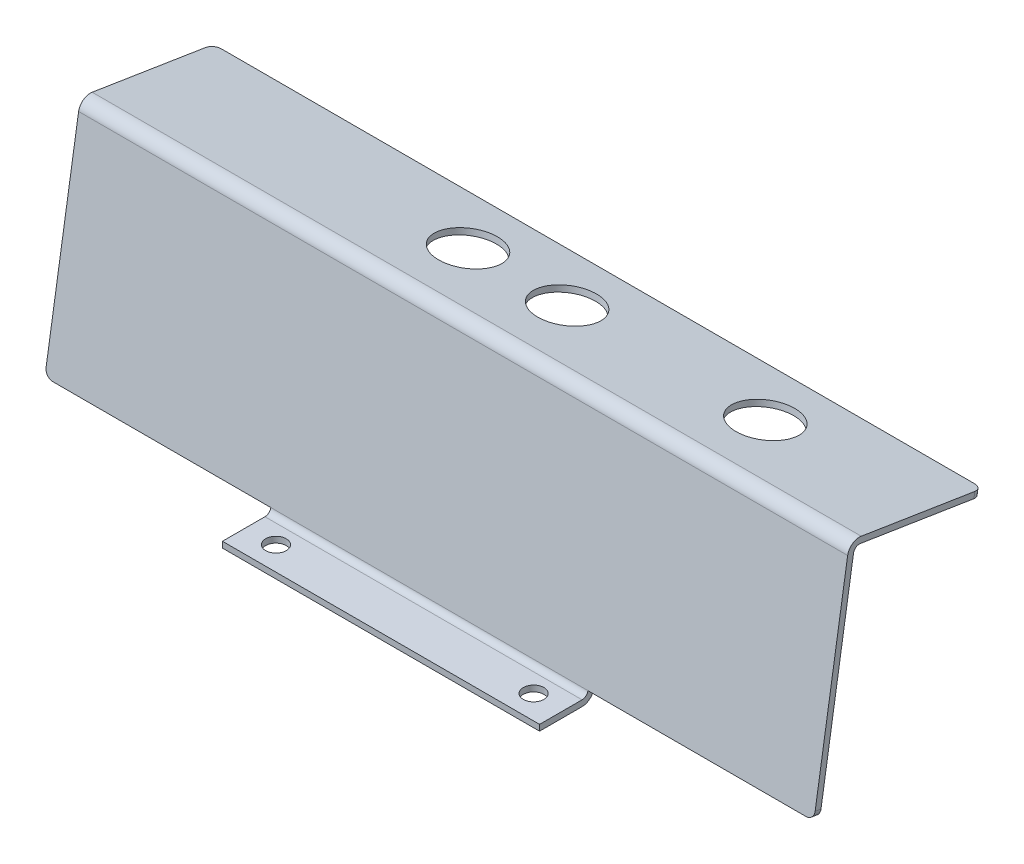
ISO-10303-21;
HEADER;
FILE_DESCRIPTION(('STEP AP214'),'2;1');
FILE_NAME('part.step','',(''),(''),'','','');
FILE_SCHEMA(('AUTOMOTIVE_DESIGN { 1 0 10303 214 1 1 1 1 }'));
ENDSEC;
DATA;
#1=APPLICATION_CONTEXT('core data for automotive mechanical design processes');
#2=APPLICATION_PROTOCOL_DEFINITION('international standard','automotive_design',2000,#1);
#3=PRODUCT_CONTEXT('',#1,'mechanical');
#4=PRODUCT('Part','Part','',(#3));
#5=PRODUCT_RELATED_PRODUCT_CATEGORY('part','',(#4));
#6=PRODUCT_DEFINITION_FORMATION('','',#4);
#7=PRODUCT_DEFINITION_CONTEXT('part definition',#1,'design');
#8=PRODUCT_DEFINITION('design','',#6,#7);
#9=PRODUCT_DEFINITION_SHAPE('','',#8);
#10=(LENGTH_UNIT() NAMED_UNIT(*) SI_UNIT(.MILLI.,.METRE.));
#11=(NAMED_UNIT(*) PLANE_ANGLE_UNIT() SI_UNIT($,.RADIAN.));
#12=(NAMED_UNIT(*) SI_UNIT($,.STERADIAN.) SOLID_ANGLE_UNIT());
#13=UNCERTAINTY_MEASURE_WITH_UNIT(LENGTH_MEASURE(1.E-05),#10,'distance_accuracy_value','');
#14=(GEOMETRIC_REPRESENTATION_CONTEXT(3) GLOBAL_UNCERTAINTY_ASSIGNED_CONTEXT((#13)) GLOBAL_UNIT_ASSIGNED_CONTEXT((#10,
#11,#12)) REPRESENTATION_CONTEXT('',''));
#15=CARTESIAN_POINT('',(0.,0.,0.));
#16=DIRECTION('',(0.,0.,1.));
#17=DIRECTION('',(1.,0.,0.));
#18=AXIS2_PLACEMENT_3D('',#15,#16,#17);
#19=CARTESIAN_POINT('',(0.,54.1771803219008,-54.767059999951));
#20=DIRECTION('',(0.,0.987688340595138,-0.15643446504023));
#21=DIRECTION('',(0.,0.15643446504023,0.987688340595138));
#22=AXIS2_PLACEMENT_3D('',#19,#20,#21);
#23=PLANE('',#22);
#24=CARTESIAN_POINT('',(79.,56.5236972975042,-39.9517348910239));
#25=DIRECTION('',(0.,0.987688340595138,-0.15643446504023));
#26=DIRECTION('',(0.,0.15643446504023,0.987688340595138));
#27=AXIS2_PLACEMENT_3D('',#24,#25,#26);
#28=CIRCLE('',#27,7.5);
#29=CARTESIAN_POINT('',(79.,57.696955785306,-32.5440723365604));
#30=VERTEX_POINT('',#29);
#31=EDGE_CURVE('E234',#30,#30,#28,.F.);
#32=ORIENTED_EDGE('',*,*,#31,.T.);
#33=EDGE_LOOP('',(#32));
#34=FACE_BOUND('',#33,.T.);
#35=CARTESIAN_POINT('',(154.,56.5236972975042,-39.9517348910239));
#36=DIRECTION('',(0.,0.987688340595138,-0.15643446504023));
#37=DIRECTION('',(0.,0.15643446504023,0.987688340595138));
#38=AXIS2_PLACEMENT_3D('',#35,#36,#37);
#39=CIRCLE('',#38,7.5);
#40=CARTESIAN_POINT('',(154.,57.696955785306,-32.5440723365604));
#41=VERTEX_POINT('',#40);
#42=EDGE_CURVE('E238',#41,#41,#39,.F.);
#43=ORIENTED_EDGE('',*,*,#42,.T.);
#44=EDGE_LOOP('',(#43));
#45=FACE_BOUND('',#44,.T.);
#46=CARTESIAN_POINT('',(104.,56.5236972975042,-39.9517348910239));
#47=DIRECTION('',(0.,0.987688340595138,-0.15643446504023));
#48=DIRECTION('',(0.,0.15643446504023,0.987688340595138));
#49=AXIS2_PLACEMENT_3D('',#46,#47,#48);
#50=CIRCLE('',#49,7.5);
#51=CARTESIAN_POINT('',(104.,57.696955785306,-32.5440723365604));
#52=VERTEX_POINT('',#51);
#53=EDGE_CURVE('E139',#52,#52,#50,.F.);
#54=ORIENTED_EDGE('',*,*,#53,.T.);
#55=EDGE_LOOP('',(#54));
#56=FACE_BOUND('',#55,.T.);
#57=CARTESIAN_POINT('',(192.,54.4900492519813,-52.7916833187607));
#58=DIRECTION('',(0.,0.987688340595139,-0.156434465040224));
#59=DIRECTION('',(0.,0.156434465040224,0.987688340595139));
#60=AXIS2_PLACEMENT_3D('',#57,#58,#59);
#61=CIRCLE('',#60,2.);
#62=CARTESIAN_POINT('',(192.,54.1771803219008,-54.767059999951));
#63=VERTEX_POINT('',#62);
#64=CARTESIAN_POINT('',(194.,54.4900492519813,-52.7916833187607));
#65=VERTEX_POINT('',#64);
#66=EDGE_CURVE('E153',#63,#65,#61,.F.);
#67=ORIENTED_EDGE('',*,*,#66,.F.);
#68=DIRECTION('',(1.,0.,0.));
#69=VECTOR('',#68,1.);
#70=CARTESIAN_POINT('',(0.,54.1771803219008,-54.767059999951));
#71=LINE('',#70,#69);
#72=CARTESIAN_POINT('',(2.,54.1771803219008,-54.767059999951));
#73=VERTEX_POINT('',#72);
#74=EDGE_CURVE('E128',#73,#63,#71,.T.);
#75=ORIENTED_EDGE('',*,*,#74,.F.);
#76=CARTESIAN_POINT('',(2.,54.4900492519813,-52.7916833187607));
#77=DIRECTION('',(0.,0.987688340595139,-0.156434465040224));
#78=DIRECTION('',(0.,0.156434465040224,0.987688340595139));
#79=AXIS2_PLACEMENT_3D('',#76,#77,#78);
#80=CIRCLE('',#79,2.);
#81=CARTESIAN_POINT('',(0.,54.4900492519813,-52.7916833187607));
#82=VERTEX_POINT('',#81);
#83=EDGE_CURVE('E20',#82,#73,#80,.F.);
#84=ORIENTED_EDGE('',*,*,#83,.F.);
#85=DIRECTION('',(0.,0.15643446504023,0.987688340595138));
#86=VECTOR('',#85,1.);
#87=CARTESIAN_POINT('',(0.,54.4900492519813,-52.7916833187607));
#88=LINE('',#87,#86);
#89=CARTESIAN_POINT('',(0.,59.0266487381479,-24.1487214415017));
#90=VERTEX_POINT('',#89);
#91=EDGE_CURVE('E125',#82,#90,#88,.T.);
#92=ORIENTED_EDGE('',*,*,#91,.T.);
#93=DIRECTION('',(1.,0.,0.));
#94=VECTOR('',#93,1.);
#95=CARTESIAN_POINT('',(97.,59.0266487381479,-24.1487214415017));
#96=LINE('',#95,#94);
#97=CARTESIAN_POINT('',(194.,59.0266487381479,-24.1487214415017));
#98=VERTEX_POINT('',#97);
#99=EDGE_CURVE('E225',#98,#90,#96,.F.);
#100=ORIENTED_EDGE('',*,*,#99,.F.);
#101=DIRECTION('',(0.,0.15643446504023,0.987688340595138));
#102=VECTOR('',#101,1.);
#103=CARTESIAN_POINT('',(194.,54.4900492519813,-52.7916833187607));
#104=LINE('',#103,#102);
#105=EDGE_CURVE('E145',#65,#98,#104,.T.);
#106=ORIENTED_EDGE('',*,*,#105,.F.);
#107=EDGE_LOOP('',(#67,#75,#84,#92,#100,#106));
#108=FACE_BOUND('',#107,.T.);
#109=ADVANCED_FACE('F17',(#34,#45,#56,#108),#23,.T.);
#110=CARTESIAN_POINT('',(2.,41.6564780579733,-50.7590453278328));
#111=DIRECTION('',(0.,0.987688340595139,-0.156434465040224));
#112=DIRECTION('',(0.,0.156434465040224,0.987688340595139));
#113=AXIS2_PLACEMENT_3D('',#110,#111,#112);
#114=CYLINDRICAL_SURFACE('',#113,2.);
#115=CARTESIAN_POINT('',(2.,53.0085167410885,-52.5570316212004));
#116=DIRECTION('',(0.,0.987688340595139,-0.156434465040224));
#117=DIRECTION('',(0.,0.156434465040224,0.987688340595139));
#118=AXIS2_PLACEMENT_3D('',#115,#116,#117);
#119=CIRCLE('',#118,2.);
#120=CARTESIAN_POINT('',(0.,53.0085167410885,-52.5570316212004));
#121=VERTEX_POINT('',#120);
#122=CARTESIAN_POINT('',(2.,52.6956478110081,-54.5324083023907));
#123=VERTEX_POINT('',#122);
#124=EDGE_CURVE('E136',#121,#123,#119,.F.);
#125=ORIENTED_EDGE('',*,*,#124,.F.);
#126=DIRECTION('',(0.,0.987688340595139,-0.156434465040224));
#127=VECTOR('',#126,1.);
#128=CARTESIAN_POINT('',(0.,53.0085167410885,-52.5570316212004));
#129=LINE('',#128,#127);
#130=EDGE_CURVE('E133',#121,#82,#129,.T.);
#131=ORIENTED_EDGE('',*,*,#130,.T.);
#132=ORIENTED_EDGE('',*,*,#83,.T.);
#133=DIRECTION('',(0.,0.987688340595139,-0.156434465040224));
#134=VECTOR('',#133,1.);
#135=CARTESIAN_POINT('',(2.,52.6956478110081,-54.5324083023906));
#136=LINE('',#135,#134);
#137=EDGE_CURVE('E131',#123,#73,#136,.T.);
#138=ORIENTED_EDGE('',*,*,#137,.F.);
#139=EDGE_LOOP('',(#125,#131,#132,#138));
#140=FACE_BOUND('',#139,.T.);
#141=ADVANCED_FACE('F134',(#140),#114,.T.);
#142=CARTESIAN_POINT('',(0.,52.6956478110081,-54.5324083023906));
#143=DIRECTION('',(0.,-0.156434465040224,-0.987688340595139));
#144=DIRECTION('',(0.,0.987688340595139,-0.156434465040224));
#145=AXIS2_PLACEMENT_3D('',#142,#143,#144);
#146=PLANE('',#145);
#147=DIRECTION('',(0.,0.987688340595139,-0.156434465040224));
#148=VECTOR('',#147,1.);
#149=CARTESIAN_POINT('',(192.,41.3436091278929,-52.734422009023));
#150=LINE('',#149,#148);
#151=CARTESIAN_POINT('',(192.,52.6956478110081,-54.5324083023906));
#152=VERTEX_POINT('',#151);
#153=EDGE_CURVE('E242',#152,#63,#150,.T.);
#154=ORIENTED_EDGE('',*,*,#153,.F.);
#155=DIRECTION('',(1.,0.,0.));
#156=VECTOR('',#155,1.);
#157=CARTESIAN_POINT('',(0.,52.6956478110081,-54.5324083023907));
#158=LINE('',#157,#156);
#159=EDGE_CURVE('E220',#123,#152,#158,.T.);
#160=ORIENTED_EDGE('',*,*,#159,.F.);
#161=ORIENTED_EDGE('',*,*,#137,.T.);
#162=ORIENTED_EDGE('',*,*,#74,.T.);
#163=EDGE_LOOP('',(#154,#160,#161,#162));
#164=FACE_BOUND('',#163,.T.);
#165=ADVANCED_FACE('F252',(#164),#146,.T.);
#166=CARTESIAN_POINT('',(192.,41.6564780579733,-50.7590453278328));
#167=DIRECTION('',(0.,0.987688340595139,-0.156434465040224));
#168=DIRECTION('',(0.,0.156434465040224,0.987688340595139));
#169=AXIS2_PLACEMENT_3D('',#166,#167,#168);
#170=CYLINDRICAL_SURFACE('',#169,2.);
#171=CARTESIAN_POINT('',(192.,53.0085167410885,-52.5570316212004));
#172=DIRECTION('',(0.,0.987688340595139,-0.156434465040224));
#173=DIRECTION('',(0.,0.156434465040224,0.987688340595139));
#174=AXIS2_PLACEMENT_3D('',#171,#172,#173);
#175=CIRCLE('',#174,2.);
#176=CARTESIAN_POINT('',(194.,53.0085167410885,-52.5570316212004));
#177=VERTEX_POINT('',#176);
#178=EDGE_CURVE('E216',#152,#177,#175,.F.);
#179=ORIENTED_EDGE('',*,*,#178,.F.);
#180=ORIENTED_EDGE('',*,*,#153,.T.);
#181=ORIENTED_EDGE('',*,*,#66,.T.);
#182=DIRECTION('',(0.,0.987688340595139,-0.156434465040224));
#183=VECTOR('',#182,1.);
#184=CARTESIAN_POINT('',(194.,53.0085167410885,-52.5570316212004));
#185=LINE('',#184,#183);
#186=EDGE_CURVE('E148',#177,#65,#185,.T.);
#187=ORIENTED_EDGE('',*,*,#186,.F.);
#188=EDGE_LOOP('',(#179,#180,#181,#187));
#189=FACE_BOUND('',#188,.T.);
#190=ADVANCED_FACE('F295',(#189),#170,.T.);
#191=CARTESIAN_POINT('',(104.,55.7829310420579,-39.8344090422437));
#192=DIRECTION('',(0.,0.987688340595138,-0.15643446504023));
#193=DIRECTION('',(0.,0.15643446504023,0.987688340595138));
#194=AXIS2_PLACEMENT_3D('',#191,#192,#193);
#195=CYLINDRICAL_SURFACE('',#194,7.5);
#196=CARTESIAN_POINT('',(104.,55.0421647866115,-39.7170831934636));
#197=DIRECTION('',(0.,0.987688340595138,-0.15643446504023));
#198=DIRECTION('',(0.,0.15643446504023,0.987688340595138));
#199=AXIS2_PLACEMENT_3D('',#196,#197,#198);
#200=CIRCLE('',#199,7.5);
#201=CARTESIAN_POINT('',(104.,56.2154232744133,-32.309420639));
#202=VERTEX_POINT('',#201);
#203=EDGE_CURVE('E212',#202,#202,#200,.T.);
#204=ORIENTED_EDGE('',*,*,#203,.F.);
#205=EDGE_LOOP('',(#204));
#206=FACE_BOUND('',#205,.T.);
#207=ORIENTED_EDGE('',*,*,#53,.F.);
#208=EDGE_LOOP('',(#207));
#209=FACE_BOUND('',#208,.T.);
#210=ADVANCED_FACE('F591',(#206,#209),#195,.F.);
#211=CARTESIAN_POINT('',(154.,55.7829310420579,-39.8344090422437));
#212=DIRECTION('',(0.,0.987688340595138,-0.15643446504023));
#213=DIRECTION('',(0.,0.15643446504023,0.987688340595138));
#214=AXIS2_PLACEMENT_3D('',#211,#212,#213);
#215=CYLINDRICAL_SURFACE('',#214,7.5);
#216=CARTESIAN_POINT('',(154.,55.0421647866115,-39.7170831934636));
#217=DIRECTION('',(0.,0.987688340595138,-0.15643446504023));
#218=DIRECTION('',(0.,0.15643446504023,0.987688340595138));
#219=AXIS2_PLACEMENT_3D('',#216,#217,#218);
#220=CIRCLE('',#219,7.5);
#221=CARTESIAN_POINT('',(154.,56.2154232744133,-32.309420639));
#222=VERTEX_POINT('',#221);
#223=EDGE_CURVE('E209',#222,#222,#220,.T.);
#224=ORIENTED_EDGE('',*,*,#223,.F.);
#225=EDGE_LOOP('',(#224));
#226=FACE_BOUND('',#225,.T.);
#227=ORIENTED_EDGE('',*,*,#42,.F.);
#228=EDGE_LOOP('',(#227));
#229=FACE_BOUND('',#228,.T.);
#230=ADVANCED_FACE('F582',(#226,#229),#215,.F.);
#231=CARTESIAN_POINT('',(79.,55.7829310420579,-39.8344090422437));
#232=DIRECTION('',(0.,0.987688340595138,-0.15643446504023));
#233=DIRECTION('',(0.,0.15643446504023,0.987688340595138));
#234=AXIS2_PLACEMENT_3D('',#231,#232,#233);
#235=CYLINDRICAL_SURFACE('',#234,7.5);
#236=CARTESIAN_POINT('',(79.,55.0421647866115,-39.7170831934636));
#237=DIRECTION('',(0.,0.987688340595138,-0.15643446504023));
#238=DIRECTION('',(0.,0.15643446504023,0.987688340595138));
#239=AXIS2_PLACEMENT_3D('',#236,#237,#238);
#240=CIRCLE('',#239,7.5);
#241=CARTESIAN_POINT('',(79.,56.2154232744133,-32.309420639));
#242=VERTEX_POINT('',#241);
#243=EDGE_CURVE('E206',#242,#242,#240,.T.);
#244=ORIENTED_EDGE('',*,*,#243,.F.);
#245=EDGE_LOOP('',(#244));
#246=FACE_BOUND('',#245,.T.);
#247=ORIENTED_EDGE('',*,*,#31,.F.);
#248=EDGE_LOOP('',(#247));
#249=FACE_BOUND('',#248,.T.);
#250=ADVANCED_FACE('F574',(#246,#249),#235,.F.);
#251=CARTESIAN_POINT('',(0.,1.5,0.));
#252=DIRECTION('',(0.,0.,1.));
#253=DIRECTION('',(1.,0.,0.));
#254=AXIS2_PLACEMENT_3D('',#251,#252,#253);
#255=PLANE('',#254);
#256=DIRECTION('',(0.,1.,0.));
#257=VECTOR('',#256,1.);
#258=CARTESIAN_POINT('',(57.,1.5,0.));
#259=LINE('',#258,#257);
#260=CARTESIAN_POINT('',(57.,1.5,0.));
#261=VERTEX_POINT('',#260);
#262=CARTESIAN_POINT('',(57.,0.,0.));
#263=VERTEX_POINT('',#262);
#264=EDGE_CURVE('E237',#261,#263,#259,.F.);
#265=ORIENTED_EDGE('',*,*,#264,.T.);
#266=DIRECTION('',(1.,0.,0.));
#267=VECTOR('',#266,1.);
#268=CARTESIAN_POINT('',(0.,0.,0.));
#269=LINE('',#268,#267);
#270=CARTESIAN_POINT('',(137.,0.,0.));
#271=VERTEX_POINT('',#270);
#272=EDGE_CURVE('E200',#271,#263,#269,.F.);
#273=ORIENTED_EDGE('',*,*,#272,.F.);
#274=DIRECTION('',(0.,1.,0.));
#275=VECTOR('',#274,1.);
#276=CARTESIAN_POINT('',(137.,-1.45955048827795,0.));
#277=LINE('',#276,#275);
#278=CARTESIAN_POINT('',(137.,1.5,0.));
#279=VERTEX_POINT('',#278);
#280=EDGE_CURVE('E281',#279,#271,#277,.F.);
#281=ORIENTED_EDGE('',*,*,#280,.F.);
#282=DIRECTION('',(1.,0.,0.));
#283=VECTOR('',#282,1.);
#284=CARTESIAN_POINT('',(0.,1.5,0.));
#285=LINE('',#284,#283);
#286=EDGE_CURVE('E233',#261,#279,#285,.T.);
#287=ORIENTED_EDGE('',*,*,#286,.F.);
#288=EDGE_LOOP('',(#265,#273,#281,#287));
#289=FACE_BOUND('',#288,.T.);
#290=ADVANCED_FACE('F389',(#289),#255,.T.);
#291=CARTESIAN_POINT('',(129.5,-208.678969407699,-6.00000000000008));
#292=DIRECTION('',(0.,1.,0.));
#293=DIRECTION('',(0.,0.,1.));
#294=AXIS2_PLACEMENT_3D('',#291,#292,#293);
#295=CYLINDRICAL_SURFACE('',#294,2.6);
#296=CARTESIAN_POINT('',(129.5,1.5,-6.00000000000003));
#297=DIRECTION('',(0.,1.,0.));
#298=DIRECTION('',(0.,0.,1.));
#299=AXIS2_PLACEMENT_3D('',#296,#297,#298);
#300=CIRCLE('',#299,2.6);
#301=CARTESIAN_POINT('',(129.5,1.5,-3.40000000000003));
#302=VERTEX_POINT('',#301);
#303=EDGE_CURVE('E230',#302,#302,#300,.F.);
#304=ORIENTED_EDGE('',*,*,#303,.F.);
#305=EDGE_LOOP('',(#304));
#306=FACE_BOUND('',#305,.T.);
#307=CARTESIAN_POINT('',(129.5,0.,-6.00000000000003));
#308=DIRECTION('',(0.,1.,0.));
#309=DIRECTION('',(0.,0.,1.));
#310=AXIS2_PLACEMENT_3D('',#307,#308,#309);
#311=CIRCLE('',#310,2.6);
#312=CARTESIAN_POINT('',(129.5,0.,-3.40000000000003));
#313=VERTEX_POINT('',#312);
#314=EDGE_CURVE('E197',#313,#313,#311,.T.);
#315=ORIENTED_EDGE('',*,*,#314,.F.);
#316=EDGE_LOOP('',(#315));
#317=FACE_BOUND('',#316,.T.);
#318=ADVANCED_FACE('F412',(#306,#317),#295,.F.);
#319=CARTESIAN_POINT('',(64.5,-208.678969407699,-6.00000000000004));
#320=DIRECTION('',(0.,1.,0.));
#321=DIRECTION('',(0.,0.,1.));
#322=AXIS2_PLACEMENT_3D('',#319,#320,#321);
#323=CYLINDRICAL_SURFACE('',#322,2.6);
#324=CARTESIAN_POINT('',(64.5,1.5,-5.99999999999999));
#325=DIRECTION('',(0.,1.,0.));
#326=DIRECTION('',(0.,0.,1.));
#327=AXIS2_PLACEMENT_3D('',#324,#325,#326);
#328=CIRCLE('',#327,2.6);
#329=CARTESIAN_POINT('',(64.5,1.5,-3.39999999999999));
#330=VERTEX_POINT('',#329);
#331=EDGE_CURVE('E226',#330,#330,#328,.F.);
#332=ORIENTED_EDGE('',*,*,#331,.F.);
#333=EDGE_LOOP('',(#332));
#334=FACE_BOUND('',#333,.T.);
#335=CARTESIAN_POINT('',(64.5,0.,-5.99999999999999));
#336=DIRECTION('',(0.,1.,0.));
#337=DIRECTION('',(0.,0.,1.));
#338=AXIS2_PLACEMENT_3D('',#335,#336,#337);
#339=CIRCLE('',#338,2.6);
#340=CARTESIAN_POINT('',(64.5,0.,-3.39999999999999));
#341=VERTEX_POINT('',#340);
#342=EDGE_CURVE('E193',#341,#341,#339,.T.);
#343=ORIENTED_EDGE('',*,*,#342,.F.);
#344=EDGE_LOOP('',(#343));
#345=FACE_BOUND('',#344,.T.);
#346=ADVANCED_FACE('F403',(#334,#345),#323,.F.);
#347=CARTESIAN_POINT('',(0.,1.5,-12.));
#348=DIRECTION('',(0.,1.,0.));
#349=DIRECTION('',(0.,0.,1.));
#350=AXIS2_PLACEMENT_3D('',#347,#348,#349);
#351=PLANE('',#350);
#352=ORIENTED_EDGE('',*,*,#331,.T.);
#353=EDGE_LOOP('',(#352));
#354=FACE_BOUND('',#353,.T.);
#355=ORIENTED_EDGE('',*,*,#303,.T.);
#356=EDGE_LOOP('',(#355));
#357=FACE_BOUND('',#356,.T.);
#358=DIRECTION('',(0.,0.,-1.));
#359=VECTOR('',#358,1.);
#360=CARTESIAN_POINT('',(57.,1.5,-5.67030667899987));
#361=LINE('',#360,#359);
#362=CARTESIAN_POINT('',(57.,1.5,-10.7188789718048));
#363=VERTEX_POINT('',#362);
#364=EDGE_CURVE('E196',#363,#261,#361,.F.);
#365=ORIENTED_EDGE('',*,*,#364,.T.);
#366=ORIENTED_EDGE('',*,*,#286,.T.);
#367=DIRECTION('',(0.,0.,-1.));
#368=VECTOR('',#367,1.);
#369=CARTESIAN_POINT('',(137.,1.5,-7.96543404151149));
#370=LINE('',#369,#368);
#371=CARTESIAN_POINT('',(137.,1.5,-10.7188789718048));
#372=VERTEX_POINT('',#371);
#373=EDGE_CURVE('E204',#372,#279,#370,.F.);
#374=ORIENTED_EDGE('',*,*,#373,.F.);
#375=DIRECTION('',(-1.,0.,0.));
#376=VECTOR('',#375,1.);
#377=CARTESIAN_POINT('',(97.,1.50000000000001,-10.7188789718048));
#378=LINE('',#377,#376);
#379=EDGE_CURVE('E229',#372,#363,#378,.T.);
#380=ORIENTED_EDGE('',*,*,#379,.T.);
#381=EDGE_LOOP('',(#365,#366,#374,#380));
#382=FACE_BOUND('',#381,.T.);
#383=ADVANCED_FACE('F401',(#354,#357,#382),#351,.T.);
#384=CARTESIAN_POINT('',(97.,3.00000000000001,-10.7188789718048));
#385=DIRECTION('',(-1.,0.,0.));
#386=DIRECTION('',(0.,-1.,0.));
#387=AXIS2_PLACEMENT_3D('',#384,#385,#386);
#388=CYLINDRICAL_SURFACE('',#387,1.5);
#389=DIRECTION('',(1.,0.,0.));
#390=VECTOR('',#389,1.);
#391=CARTESIAN_POINT('',(0.,2.76534830243966,-12.2004114826975));
#392=LINE('',#391,#390);
#393=CARTESIAN_POINT('',(57.,2.76534830243966,-12.2004114826975));
#394=VERTEX_POINT('',#393);
#395=CARTESIAN_POINT('',(137.,2.76534830243966,-12.2004114826975));
#396=VERTEX_POINT('',#395);
#397=EDGE_CURVE('E192',#394,#396,#392,.T.);
#398=ORIENTED_EDGE('',*,*,#397,.F.);
#399=CARTESIAN_POINT('',(57.,3.00000000000001,-10.7188789718048));
#400=DIRECTION('',(-1.,0.,0.));
#401=DIRECTION('',(0.,-1.,0.));
#402=AXIS2_PLACEMENT_3D('',#399,#400,#401);
#403=CIRCLE('',#402,1.5);
#404=EDGE_CURVE('E189',#394,#363,#403,.T.);
#405=ORIENTED_EDGE('',*,*,#404,.T.);
#406=ORIENTED_EDGE('',*,*,#379,.F.);
#407=CARTESIAN_POINT('',(137.,3.00000000000001,-10.7188789718048));
#408=DIRECTION('',(-1.,0.,0.));
#409=DIRECTION('',(0.,-1.,0.));
#410=AXIS2_PLACEMENT_3D('',#407,#408,#409);
#411=CIRCLE('',#410,1.5);
#412=EDGE_CURVE('E201',#396,#372,#411,.T.);
#413=ORIENTED_EDGE('',*,*,#412,.F.);
#414=EDGE_LOOP('',(#398,#405,#406,#413));
#415=FACE_BOUND('',#414,.T.);
#416=ADVANCED_FACE('F397',(#415),#388,.F.);
#417=CARTESIAN_POINT('',(97.,56.0635837163625,-23.679418046381));
#418=DIRECTION('',(1.,0.,0.));
#419=DIRECTION('',(0.,0.,-1.));
#420=AXIS2_PLACEMENT_3D('',#417,#418,#419);
#421=CYLINDRICAL_SURFACE('',#420,3.00000000000001);
#422=ORIENTED_EDGE('',*,*,#99,.T.);
#423=CARTESIAN_POINT('',(0.,56.0635837163625,-23.679418046381));
#424=DIRECTION('',(1.,0.,0.));
#425=DIRECTION('',(0.,0.,-1.));
#426=AXIS2_PLACEMENT_3D('',#423,#424,#425);
#427=CIRCLE('',#426,3.00000000000001);
#428=CARTESIAN_POINT('',(0.,56.5328871114832,-20.7163530245956));
#429=VERTEX_POINT('',#428);
#430=EDGE_CURVE('E143',#429,#90,#427,.F.);
#431=ORIENTED_EDGE('',*,*,#430,.F.);
#432=DIRECTION('',(1.,0.,0.));
#433=VECTOR('',#432,1.);
#434=CARTESIAN_POINT('',(0.,56.5328871114832,-20.7163530245956));
#435=LINE('',#434,#433);
#436=CARTESIAN_POINT('',(194.,56.5328871114832,-20.7163530245956));
#437=VERTEX_POINT('',#436);
#438=EDGE_CURVE('E188',#437,#429,#435,.F.);
#439=ORIENTED_EDGE('',*,*,#438,.F.);
#440=CARTESIAN_POINT('',(194.,56.0635837163625,-23.679418046381));
#441=DIRECTION('',(1.,0.,0.));
#442=DIRECTION('',(0.,0.,-1.));
#443=AXIS2_PLACEMENT_3D('',#440,#441,#442);
#444=CIRCLE('',#443,3.00000000000001);
#445=EDGE_CURVE('E222',#98,#437,#444,.T.);
#446=ORIENTED_EDGE('',*,*,#445,.F.);
#447=EDGE_LOOP('',(#422,#431,#439,#446));
#448=FACE_BOUND('',#447,.T.);
#449=ADVANCED_FACE('F288',(#448),#421,.T.);
#450=CARTESIAN_POINT('',(0.,57.7797679248156,-22.4325372330487));
#451=DIRECTION('',(0.,-0.987688340595138,0.15643446504023));
#452=DIRECTION('',(0.,-0.15643446504023,-0.987688340595138));
#453=AXIS2_PLACEMENT_3D('',#450,#451,#452);
#454=PLANE('',#453);
#455=ORIENTED_EDGE('',*,*,#243,.T.);
#456=EDGE_LOOP('',(#455));
#457=FACE_BOUND('',#456,.T.);
#458=ORIENTED_EDGE('',*,*,#223,.T.);
#459=EDGE_LOOP('',(#458));
#460=FACE_BOUND('',#459,.T.);
#461=ORIENTED_EDGE('',*,*,#203,.T.);
#462=EDGE_LOOP('',(#461));
#463=FACE_BOUND('',#462,.T.);
#464=DIRECTION('',(1.,0.,0.));
#465=VECTOR('',#464,1.);
#466=CARTESIAN_POINT('',(97.,57.5451162272552,-23.9140697439414));
#467=LINE('',#466,#465);
#468=CARTESIAN_POINT('',(194.,57.5451162272552,-23.9140697439414));
#469=VERTEX_POINT('',#468);
#470=CARTESIAN_POINT('',(0.,57.5451162272552,-23.9140697439414));
#471=VERTEX_POINT('',#470);
#472=EDGE_CURVE('E180',#469,#471,#467,.F.);
#473=ORIENTED_EDGE('',*,*,#472,.T.);
#474=DIRECTION('',(0.,-0.15643446504023,-0.987688340595138));
#475=VECTOR('',#474,1.);
#476=CARTESIAN_POINT('',(0.,57.7797679248156,-22.4325372330487));
#477=LINE('',#476,#475);
#478=EDGE_CURVE('E215',#471,#121,#477,.T.);
#479=ORIENTED_EDGE('',*,*,#478,.T.);
#480=ORIENTED_EDGE('',*,*,#124,.T.);
#481=ORIENTED_EDGE('',*,*,#159,.T.);
#482=ORIENTED_EDGE('',*,*,#178,.T.);
#483=DIRECTION('',(0.,-0.15643446504023,-0.987688340595138));
#484=VECTOR('',#483,1.);
#485=CARTESIAN_POINT('',(194.,57.7797679248156,-22.4325372330487));
#486=LINE('',#485,#484);
#487=EDGE_CURVE('E219',#177,#469,#486,.F.);
#488=ORIENTED_EDGE('',*,*,#487,.T.);
#489=EDGE_LOOP('',(#473,#479,#480,#481,#482,#488));
#490=FACE_BOUND('',#489,.T.);
#491=ADVANCED_FACE('F257',(#457,#460,#463,#490),#454,.T.);
#492=CARTESIAN_POINT('',(137.,-1.45955048827795,-7.96543404151149));
#493=DIRECTION('',(1.,0.,0.));
#494=DIRECTION('',(0.,0.,-1.));
#495=AXIS2_PLACEMENT_3D('',#492,#493,#494);
#496=PLANE('',#495);
#497=ORIENTED_EDGE('',*,*,#280,.T.);
#498=DIRECTION('',(0.,0.,-1.));
#499=VECTOR('',#498,1.);
#500=CARTESIAN_POINT('',(137.,0.,0.));
#501=LINE('',#500,#499);
#502=CARTESIAN_POINT('',(137.,0.,-10.7188789718048));
#503=VERTEX_POINT('',#502);
#504=EDGE_CURVE('E270',#503,#271,#501,.F.);
#505=ORIENTED_EDGE('',*,*,#504,.F.);
#506=CARTESIAN_POINT('',(137.,3.00000000000001,-10.7188789718048));
#507=DIRECTION('',(-1.,0.,0.));
#508=DIRECTION('',(0.,-1.,0.));
#509=AXIS2_PLACEMENT_3D('',#506,#507,#508);
#510=CIRCLE('',#509,3.);
#511=CARTESIAN_POINT('',(137.,2.53069660487931,-13.6819439935902));
#512=VERTEX_POINT('',#511);
#513=EDGE_CURVE('E168',#512,#503,#510,.T.);
#514=ORIENTED_EDGE('',*,*,#513,.F.);
#515=DIRECTION('',(0.,0.15643446504023,0.987688340595138));
#516=VECTOR('',#515,1.);
#517=CARTESIAN_POINT('',(137.,2.76534830243966,-12.2004114826975));
#518=LINE('',#517,#516);
#519=EDGE_CURVE('E175',#512,#396,#518,.T.);
#520=ORIENTED_EDGE('',*,*,#519,.T.);
#521=ORIENTED_EDGE('',*,*,#412,.T.);
#522=ORIENTED_EDGE('',*,*,#373,.T.);
#523=EDGE_LOOP('',(#497,#505,#514,#520,#521,#522));
#524=FACE_BOUND('',#523,.T.);
#525=ADVANCED_FACE('F384',(#524),#496,.T.);
#526=CARTESIAN_POINT('',(0.,0.,0.));
#527=DIRECTION('',(0.,-1.,0.));
#528=DIRECTION('',(0.,0.,-1.));
#529=AXIS2_PLACEMENT_3D('',#526,#527,#528);
#530=PLANE('',#529);
#531=ORIENTED_EDGE('',*,*,#342,.T.);
#532=EDGE_LOOP('',(#531));
#533=FACE_BOUND('',#532,.T.);
#534=ORIENTED_EDGE('',*,*,#314,.T.);
#535=EDGE_LOOP('',(#534));
#536=FACE_BOUND('',#535,.T.);
#537=DIRECTION('',(0.,0.,-1.));
#538=VECTOR('',#537,1.);
#539=CARTESIAN_POINT('',(57.,0.,-5.67030667899987));
#540=LINE('',#539,#538);
#541=CARTESIAN_POINT('',(57.,0.,-10.7188789718048));
#542=VERTEX_POINT('',#541);
#543=EDGE_CURVE('E337',#263,#542,#540,.T.);
#544=ORIENTED_EDGE('',*,*,#543,.T.);
#545=DIRECTION('',(-1.,0.,0.));
#546=VECTOR('',#545,1.);
#547=CARTESIAN_POINT('',(97.,0.,-10.7188789718048));
#548=LINE('',#547,#546);
#549=EDGE_CURVE('E167',#503,#542,#548,.T.);
#550=ORIENTED_EDGE('',*,*,#549,.F.);
#551=ORIENTED_EDGE('',*,*,#504,.T.);
#552=ORIENTED_EDGE('',*,*,#272,.T.);
#553=EDGE_LOOP('',(#544,#550,#551,#552));
#554=FACE_BOUND('',#553,.T.);
#555=ADVANCED_FACE('F392',(#533,#536,#554),#530,.T.);
#556=CARTESIAN_POINT('',(57.,-2.28831407290554,-5.67030667899987));
#557=DIRECTION('',(1.,0.,0.));
#558=DIRECTION('',(0.,0.,-1.));
#559=AXIS2_PLACEMENT_3D('',#556,#557,#558);
#560=PLANE('',#559);
#561=DIRECTION('',(0.,0.156434465040231,0.987688340595138));
#562=VECTOR('',#561,1.);
#563=CARTESIAN_POINT('',(57.,2.53069660487931,-13.6819439935902));
#564=LINE('',#563,#562);
#565=CARTESIAN_POINT('',(57.,2.53069660487931,-13.6819439935902));
#566=VERTEX_POINT('',#565);
#567=EDGE_CURVE('E35',#566,#394,#564,.T.);
#568=ORIENTED_EDGE('',*,*,#567,.F.);
#569=CARTESIAN_POINT('',(57.,3.00000000000001,-10.7188789718048));
#570=DIRECTION('',(-1.,0.,0.));
#571=DIRECTION('',(0.,-1.,0.));
#572=AXIS2_PLACEMENT_3D('',#569,#570,#571);
#573=CIRCLE('',#572,3.);
#574=EDGE_CURVE('E164',#542,#566,#573,.F.);
#575=ORIENTED_EDGE('',*,*,#574,.F.);
#576=ORIENTED_EDGE('',*,*,#543,.F.);
#577=ORIENTED_EDGE('',*,*,#264,.F.);
#578=ORIENTED_EDGE('',*,*,#364,.F.);
#579=ORIENTED_EDGE('',*,*,#404,.F.);
#580=EDGE_LOOP('',(#568,#575,#576,#577,#578,#579));
#581=FACE_BOUND('',#580,.T.);
#582=ADVANCED_FACE('F399',(#581),#560,.F.);
#583=CARTESIAN_POINT('',(0.,59.4959521332686,-21.1856564197163));
#584=DIRECTION('',(0.,0.15643446504023,0.987688340595138));
#585=DIRECTION('',(0.,-0.987688340595138,0.15643446504023));
#586=AXIS2_PLACEMENT_3D('',#583,#584,#585);
#587=PLANE('',#586);
#588=ORIENTED_EDGE('',*,*,#438,.T.);
#589=DIRECTION('',(0.,-0.987688340595138,0.15643446504023));
#590=VECTOR('',#589,1.);
#591=CARTESIAN_POINT('',(0.,56.5328871114832,-20.7163530245956));
#592=LINE('',#591,#590);
#593=CARTESIAN_POINT('',(0.,4.74072498362993,-12.513280412778));
#594=VERTEX_POINT('',#593);
#595=EDGE_CURVE('E187',#429,#594,#592,.T.);
#596=ORIENTED_EDGE('',*,*,#595,.T.);
#597=CARTESIAN_POINT('',(2.,4.74072498362993,-12.513280412778));
#598=DIRECTION('',(0.,0.15643446504023,0.987688340595138));
#599=DIRECTION('',(0.,-0.987688340595138,0.15643446504023));
#600=AXIS2_PLACEMENT_3D('',#597,#598,#599);
#601=CIRCLE('',#600,2.);
#602=CARTESIAN_POINT('',(2.,2.76534830243966,-12.2004114826975));
#603=VERTEX_POINT('',#602);
#604=EDGE_CURVE('E184',#603,#594,#601,.F.);
#605=ORIENTED_EDGE('',*,*,#604,.F.);
#606=DIRECTION('',(1.,0.,0.));
#607=VECTOR('',#606,1.);
#608=CARTESIAN_POINT('',(0.,2.76534830243966,-12.2004114826975));
#609=LINE('',#608,#607);
#610=EDGE_CURVE('E166',#603,#394,#609,.T.);
#611=ORIENTED_EDGE('',*,*,#610,.T.);
#612=ORIENTED_EDGE('',*,*,#397,.T.);
#613=DIRECTION('',(1.,0.,0.));
#614=VECTOR('',#613,1.);
#615=CARTESIAN_POINT('',(194.,2.76534830243966,-12.2004114826975));
#616=LINE('',#615,#614);
#617=CARTESIAN_POINT('',(192.,2.76534830243966,-12.2004114826975));
#618=VERTEX_POINT('',#617);
#619=EDGE_CURVE('E327',#396,#618,#616,.T.);
#620=ORIENTED_EDGE('',*,*,#619,.T.);
#621=CARTESIAN_POINT('',(192.,4.74072498362993,-12.513280412778));
#622=DIRECTION('',(0.,-0.15643446504023,-0.987688340595138));
#623=DIRECTION('',(0.,0.987688340595138,-0.15643446504023));
#624=AXIS2_PLACEMENT_3D('',#621,#622,#623);
#625=CIRCLE('',#624,2.);
#626=CARTESIAN_POINT('',(194.,4.74072498362994,-12.513280412778));
#627=VERTEX_POINT('',#626);
#628=EDGE_CURVE('E172',#627,#618,#625,.T.);
#629=ORIENTED_EDGE('',*,*,#628,.F.);
#630=DIRECTION('',(0.,-0.987688340595138,0.15643446504023));
#631=VECTOR('',#630,1.);
#632=CARTESIAN_POINT('',(194.,56.5328871114832,-20.7163530245956));
#633=LINE('',#632,#631);
#634=EDGE_CURVE('E179',#437,#627,#633,.T.);
#635=ORIENTED_EDGE('',*,*,#634,.F.);
#636=EDGE_LOOP('',(#588,#596,#605,#611,#612,#620,#629,#635));
#637=FACE_BOUND('',#636,.T.);
#638=ADVANCED_FACE('F358',(#637),#587,.T.);
#639=CARTESIAN_POINT('',(2.,4.20363733669985,-15.904318357096));
#640=DIRECTION('',(0.,0.15643446504023,0.987688340595138));
#641=DIRECTION('',(0.,-0.987688340595138,0.15643446504023));
#642=AXIS2_PLACEMENT_3D('',#639,#640,#641);
#643=CYLINDRICAL_SURFACE('',#642,2.);
#644=CARTESIAN_POINT('',(2.,4.50607328606959,-13.9948129236707));
#645=DIRECTION('',(0.,0.15643446504023,0.987688340595138));
#646=DIRECTION('',(0.,-0.987688340595138,0.15643446504023));
#647=AXIS2_PLACEMENT_3D('',#644,#645,#646);
#648=CIRCLE('',#647,2.);
#649=CARTESIAN_POINT('',(2.,2.53069660487931,-13.6819439935902));
#650=VERTEX_POINT('',#649);
#651=CARTESIAN_POINT('',(0.,4.50607328606959,-13.9948129236707));
#652=VERTEX_POINT('',#651);
#653=EDGE_CURVE('E159',#650,#652,#648,.F.);
#654=ORIENTED_EDGE('',*,*,#653,.F.);
#655=DIRECTION('',(0.,0.15643446504023,0.987688340595138));
#656=VECTOR('',#655,1.);
#657=CARTESIAN_POINT('',(2.,2.53069660487931,-13.6819439935902));
#658=LINE('',#657,#656);
#659=EDGE_CURVE('E163',#650,#603,#658,.T.);
#660=ORIENTED_EDGE('',*,*,#659,.T.);
#661=ORIENTED_EDGE('',*,*,#604,.T.);
#662=DIRECTION('',(0.,-0.156434465040224,-0.987688340595139));
#663=VECTOR('',#662,1.);
#664=CARTESIAN_POINT('',(0.,4.74072498362992,-12.513280412778));
#665=LINE('',#664,#663);
#666=EDGE_CURVE('E183',#594,#652,#665,.T.);
#667=ORIENTED_EDGE('',*,*,#666,.T.);
#668=EDGE_LOOP('',(#654,#660,#661,#667));
#669=FACE_BOUND('',#668,.T.);
#670=ADVANCED_FACE('F314',(#669),#643,.T.);
#671=CARTESIAN_POINT('',(0.,34.4708186598455,-22.655575513164));
#672=DIRECTION('',(1.,0.,0.));
#673=DIRECTION('',(0.,0.,-1.));
#674=AXIS2_PLACEMENT_3D('',#671,#672,#673);
#675=PLANE('',#674);
#676=ORIENTED_EDGE('',*,*,#595,.F.);
#677=ORIENTED_EDGE('',*,*,#430,.T.);
#678=ORIENTED_EDGE('',*,*,#91,.F.);
#679=ORIENTED_EDGE('',*,*,#130,.F.);
#680=ORIENTED_EDGE('',*,*,#478,.F.);
#681=CARTESIAN_POINT('',(0.,56.0635837163625,-23.679418046381));
#682=DIRECTION('',(1.,0.,0.));
#683=DIRECTION('',(0.,0.,-1.));
#684=AXIS2_PLACEMENT_3D('',#681,#682,#683);
#685=CIRCLE('',#684,1.5);
#686=CARTESIAN_POINT('',(0.,56.2982354139229,-22.1978855354883));
#687=VERTEX_POINT('',#686);
#688=EDGE_CURVE('E177',#471,#687,#685,.T.);
#689=ORIENTED_EDGE('',*,*,#688,.T.);
#690=DIRECTION('',(0.,0.987688340595138,-0.15643446504023));
#691=VECTOR('',#690,1.);
#692=CARTESIAN_POINT('',(0.,0.,-13.2811210281952));
#693=LINE('',#692,#691);
#694=EDGE_CURVE('E162',#652,#687,#693,.T.);
#695=ORIENTED_EDGE('',*,*,#694,.F.);
#696=ORIENTED_EDGE('',*,*,#666,.F.);
#697=EDGE_LOOP('',(#676,#677,#678,#679,#680,#689,#695,#696));
#698=FACE_BOUND('',#697,.T.);
#699=ADVANCED_FACE('F142',(#698),#675,.F.);
#700=CARTESIAN_POINT('',(97.,56.0635837163625,-23.679418046381));
#701=DIRECTION('',(1.,0.,0.));
#702=DIRECTION('',(0.,0.,-1.));
#703=AXIS2_PLACEMENT_3D('',#700,#701,#702);
#704=CYLINDRICAL_SURFACE('',#703,1.5);
#705=ORIENTED_EDGE('',*,*,#688,.F.);
#706=ORIENTED_EDGE('',*,*,#472,.F.);
#707=CARTESIAN_POINT('',(194.,56.0635837163625,-23.679418046381));
#708=DIRECTION('',(1.,0.,0.));
#709=DIRECTION('',(0.,0.,-1.));
#710=AXIS2_PLACEMENT_3D('',#707,#708,#709);
#711=CIRCLE('',#710,1.5);
#712=CARTESIAN_POINT('',(194.,56.2982354139229,-22.1978855354883));
#713=VERTEX_POINT('',#712);
#714=EDGE_CURVE('E181',#713,#469,#711,.F.);
#715=ORIENTED_EDGE('',*,*,#714,.F.);
#716=DIRECTION('',(1.,0.,0.));
#717=VECTOR('',#716,1.);
#718=CARTESIAN_POINT('',(0.,56.2982354139229,-22.1978855354883));
#719=LINE('',#718,#717);
#720=EDGE_CURVE('E300',#687,#713,#719,.T.);
#721=ORIENTED_EDGE('',*,*,#720,.F.);
#722=EDGE_LOOP('',(#705,#706,#715,#721));
#723=FACE_BOUND('',#722,.T.);
#724=ADVANCED_FACE('F297',(#723),#704,.F.);
#725=CARTESIAN_POINT('',(194.,34.4708186598455,-22.655575513164));
#726=DIRECTION('',(1.,0.,0.));
#727=DIRECTION('',(0.,0.,-1.));
#728=AXIS2_PLACEMENT_3D('',#725,#726,#727);
#729=PLANE('',#728);
#730=DIRECTION('',(0.,0.987688340595138,-0.15643446504023));
#731=VECTOR('',#730,1.);
#732=CARTESIAN_POINT('',(194.,0.,-13.2811210281952));
#733=LINE('',#732,#731);
#734=CARTESIAN_POINT('',(194.,4.50607328606959,-13.9948129236707));
#735=VERTEX_POINT('',#734);
#736=EDGE_CURVE('E158',#713,#735,#733,.F.);
#737=ORIENTED_EDGE('',*,*,#736,.F.);
#738=ORIENTED_EDGE('',*,*,#714,.T.);
#739=ORIENTED_EDGE('',*,*,#487,.F.);
#740=ORIENTED_EDGE('',*,*,#186,.T.);
#741=ORIENTED_EDGE('',*,*,#105,.T.);
#742=ORIENTED_EDGE('',*,*,#445,.T.);
#743=ORIENTED_EDGE('',*,*,#634,.T.);
#744=DIRECTION('',(0.,-0.15643446504023,-0.987688340595138));
#745=VECTOR('',#744,1.);
#746=CARTESIAN_POINT('',(194.,4.32096318548003,-15.1635521016497));
#747=LINE('',#746,#745);
#748=EDGE_CURVE('E176',#735,#627,#747,.F.);
#749=ORIENTED_EDGE('',*,*,#748,.F.);
#750=EDGE_LOOP('',(#737,#738,#739,#740,#741,#742,#743,#749));
#751=FACE_BOUND('',#750,.T.);
#752=ADVANCED_FACE('F293',(#751),#729,.T.);
#753=CARTESIAN_POINT('',(192.,4.32096318548003,-15.1635521016497));
#754=DIRECTION('',(0.,-0.15643446504023,-0.987688340595138));
#755=DIRECTION('',(0.,0.987688340595138,-0.15643446504023));
#756=AXIS2_PLACEMENT_3D('',#753,#754,#755);
#757=CYLINDRICAL_SURFACE('',#756,2.);
#758=ORIENTED_EDGE('',*,*,#628,.T.);
#759=DIRECTION('',(0.,0.15643446504023,0.987688340595138));
#760=VECTOR('',#759,1.);
#761=CARTESIAN_POINT('',(192.,2.76534830243966,-12.2004114826975));
#762=LINE('',#761,#760);
#763=CARTESIAN_POINT('',(192.,2.53069660487931,-13.6819439935902));
#764=VERTEX_POINT('',#763);
#765=EDGE_CURVE('E171',#618,#764,#762,.F.);
#766=ORIENTED_EDGE('',*,*,#765,.T.);
#767=CARTESIAN_POINT('',(192.,4.50607328606959,-13.9948129236707));
#768=DIRECTION('',(0.,-0.15643446504023,-0.987688340595138));
#769=DIRECTION('',(0.,0.987688340595138,-0.15643446504023));
#770=AXIS2_PLACEMENT_3D('',#767,#768,#769);
#771=CIRCLE('',#770,2.);
#772=EDGE_CURVE('E154',#735,#764,#771,.T.);
#773=ORIENTED_EDGE('',*,*,#772,.F.);
#774=ORIENTED_EDGE('',*,*,#748,.T.);
#775=EDGE_LOOP('',(#758,#766,#773,#774));
#776=FACE_BOUND('',#775,.T.);
#777=ADVANCED_FACE('F365',(#776),#757,.T.);
#778=CARTESIAN_POINT('',(194.,2.76534830243966,-12.2004114826975));
#779=DIRECTION('',(0.,0.987688340595138,-0.15643446504023));
#780=DIRECTION('',(0.,0.15643446504023,0.987688340595138));
#781=AXIS2_PLACEMENT_3D('',#778,#779,#780);
#782=PLANE('',#781);
#783=ORIENTED_EDGE('',*,*,#619,.F.);
#784=ORIENTED_EDGE('',*,*,#519,.F.);
#785=DIRECTION('',(1.,0.,0.));
#786=VECTOR('',#785,1.);
#787=CARTESIAN_POINT('',(0.,2.53069660487931,-13.6819439935902));
#788=LINE('',#787,#786);
#789=EDGE_CURVE('E157',#764,#512,#788,.F.);
#790=ORIENTED_EDGE('',*,*,#789,.F.);
#791=ORIENTED_EDGE('',*,*,#765,.F.);
#792=EDGE_LOOP('',(#783,#784,#790,#791));
#793=FACE_BOUND('',#792,.T.);
#794=ADVANCED_FACE('F374',(#793),#782,.F.);
#795=CARTESIAN_POINT('',(97.,3.00000000000001,-10.7188789718048));
#796=DIRECTION('',(-1.,0.,0.));
#797=DIRECTION('',(0.,-1.,0.));
#798=AXIS2_PLACEMENT_3D('',#795,#796,#797);
#799=CYLINDRICAL_SURFACE('',#798,3.);
#800=ORIENTED_EDGE('',*,*,#574,.T.);
#801=DIRECTION('',(1.,0.,0.));
#802=VECTOR('',#801,1.);
#803=CARTESIAN_POINT('',(0.,2.53069660487931,-13.6819439935902));
#804=LINE('',#803,#802);
#805=EDGE_CURVE('E26',#512,#566,#804,.F.);
#806=ORIENTED_EDGE('',*,*,#805,.F.);
#807=ORIENTED_EDGE('',*,*,#513,.T.);
#808=ORIENTED_EDGE('',*,*,#549,.T.);
#809=EDGE_LOOP('',(#800,#806,#807,#808));
#810=FACE_BOUND('',#809,.T.);
#811=ADVANCED_FACE('F394',(#810),#799,.T.);
#812=CARTESIAN_POINT('',(0.,2.53069660487931,-13.6819439935902));
#813=DIRECTION('',(0.,0.987688340595138,-0.15643446504023));
#814=DIRECTION('',(0.,0.15643446504023,0.987688340595138));
#815=AXIS2_PLACEMENT_3D('',#812,#813,#814);
#816=PLANE('',#815);
#817=DIRECTION('',(1.,0.,0.));
#818=VECTOR('',#817,1.);
#819=CARTESIAN_POINT('',(0.,2.53069660487931,-13.6819439935902));
#820=LINE('',#819,#818);
#821=EDGE_CURVE('E11',#566,#650,#820,.F.);
#822=ORIENTED_EDGE('',*,*,#821,.F.);
#823=ORIENTED_EDGE('',*,*,#567,.T.);
#824=ORIENTED_EDGE('',*,*,#610,.F.);
#825=ORIENTED_EDGE('',*,*,#659,.F.);
#826=EDGE_LOOP('',(#822,#823,#824,#825));
#827=FACE_BOUND('',#826,.T.);
#828=ADVANCED_FACE('F318',(#827),#816,.F.);
#829=CARTESIAN_POINT('',(0.,0.,-13.2811210281952));
#830=DIRECTION('',(0.,-0.15643446504023,-0.987688340595138));
#831=DIRECTION('',(0.,0.987688340595138,-0.15643446504023));
#832=AXIS2_PLACEMENT_3D('',#829,#830,#831);
#833=PLANE('',#832);
#834=ORIENTED_EDGE('',*,*,#805,.T.);
#835=ORIENTED_EDGE('',*,*,#821,.T.);
#836=ORIENTED_EDGE('',*,*,#653,.T.);
#837=ORIENTED_EDGE('',*,*,#694,.T.);
#838=ORIENTED_EDGE('',*,*,#720,.T.);
#839=ORIENTED_EDGE('',*,*,#736,.T.);
#840=ORIENTED_EDGE('',*,*,#772,.T.);
#841=ORIENTED_EDGE('',*,*,#789,.T.);
#842=EDGE_LOOP('',(#834,#835,#836,#837,#838,#839,#840,#841));
#843=FACE_BOUND('',#842,.T.);
#844=ADVANCED_FACE('F309',(#843),#833,.T.);
#845=CLOSED_SHELL('',(#109,#141,#165,#190,#210,#230,#250,#290,#318,#346,#383,#416,#449,#491,
#525,#555,#582,#638,#670,#699,#724,#752,#777,#794,#811,#828,#844));
#846=MANIFOLD_SOLID_BREP('B1',#845);
#847=ADVANCED_BREP_SHAPE_REPRESENTATION('',(#18,#846),#14);
#848=SHAPE_DEFINITION_REPRESENTATION(#9,#847);
ENDSEC;
END-ISO-10303-21;
